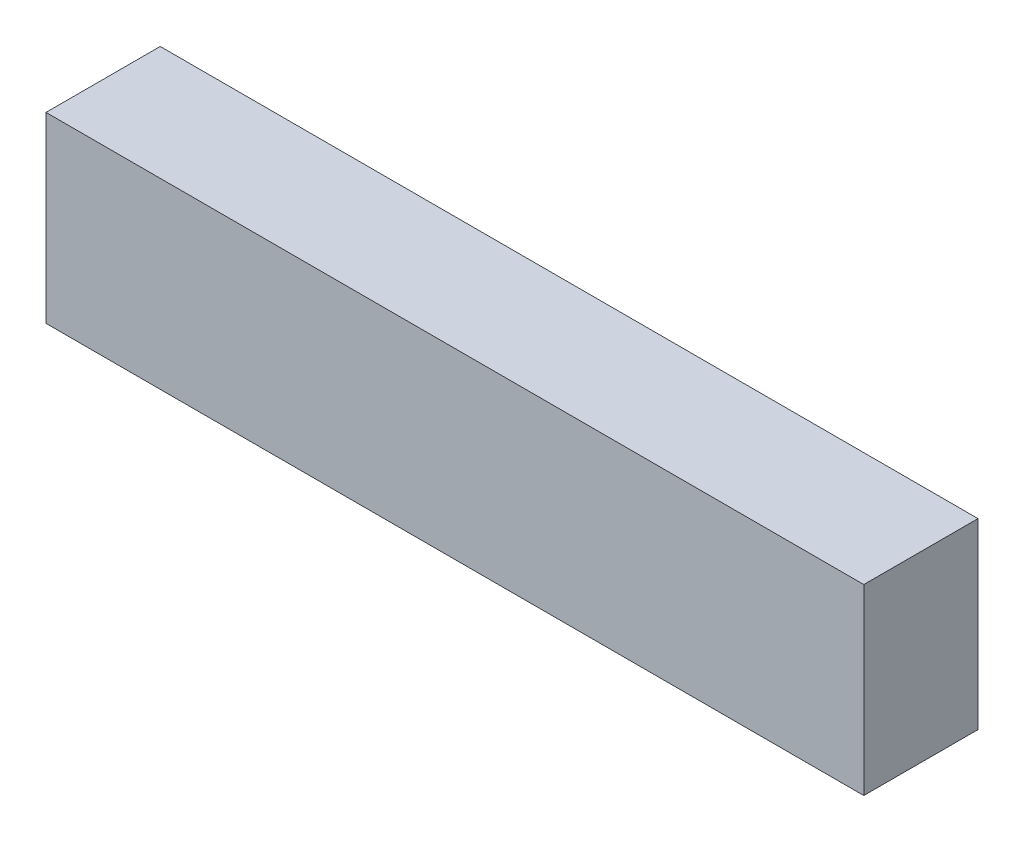
ISO-10303-21;
HEADER;
FILE_DESCRIPTION(('STEP AP214'),'2;1');
FILE_NAME('part.step','',(''),(''),'','','');
FILE_SCHEMA(('AUTOMOTIVE_DESIGN { 1 0 10303 214 1 1 1 1 }'));
ENDSEC;
DATA;
#1=APPLICATION_CONTEXT('core data for automotive mechanical design processes');
#2=APPLICATION_PROTOCOL_DEFINITION('international standard','automotive_design',2000,#1);
#3=PRODUCT_CONTEXT('',#1,'mechanical');
#4=PRODUCT('Part','Part','',(#3));
#5=PRODUCT_RELATED_PRODUCT_CATEGORY('part','',(#4));
#6=PRODUCT_DEFINITION_FORMATION('','',#4);
#7=PRODUCT_DEFINITION_CONTEXT('part definition',#1,'design');
#8=PRODUCT_DEFINITION('design','',#6,#7);
#9=PRODUCT_DEFINITION_SHAPE('','',#8);
#10=(LENGTH_UNIT() NAMED_UNIT(*) SI_UNIT(.MILLI.,.METRE.));
#11=(NAMED_UNIT(*) PLANE_ANGLE_UNIT() SI_UNIT($,.RADIAN.));
#12=(NAMED_UNIT(*) SI_UNIT($,.STERADIAN.) SOLID_ANGLE_UNIT());
#13=UNCERTAINTY_MEASURE_WITH_UNIT(LENGTH_MEASURE(1.E-05),#10,'distance_accuracy_value','');
#14=(GEOMETRIC_REPRESENTATION_CONTEXT(3) GLOBAL_UNCERTAINTY_ASSIGNED_CONTEXT((#13)) GLOBAL_UNIT_ASSIGNED_CONTEXT((#10,
#11,#12)) REPRESENTATION_CONTEXT('',''));
#15=CARTESIAN_POINT('',(0.,0.,0.));
#16=DIRECTION('',(0.,0.,1.));
#17=DIRECTION('',(1.,0.,0.));
#18=AXIS2_PLACEMENT_3D('',#15,#16,#17);
#19=CARTESIAN_POINT('',(0.,0.,25.));
#20=DIRECTION('',(1.,0.,0.));
#21=DIRECTION('',(0.,0.,-1.));
#22=AXIS2_PLACEMENT_3D('',#19,#20,#21);
#23=PLANE('',#22);
#24=DIRECTION('',(0.,-1.,0.));
#25=VECTOR('',#24,1.);
#26=CARTESIAN_POINT('',(0.,0.,0.));
#27=LINE('',#26,#25);
#28=CARTESIAN_POINT('',(0.,40.,0.));
#29=VERTEX_POINT('',#28);
#30=CARTESIAN_POINT('',(0.,0.,0.));
#31=VERTEX_POINT('',#30);
#32=EDGE_CURVE('E96',#29,#31,#27,.T.);
#33=ORIENTED_EDGE('',*,*,#32,.T.);
#34=DIRECTION('',(0.,0.,-1.));
#35=VECTOR('',#34,1.);
#36=CARTESIAN_POINT('',(0.,0.,25.));
#37=LINE('',#36,#35);
#38=CARTESIAN_POINT('',(0.,0.,25.));
#39=VERTEX_POINT('',#38);
#40=EDGE_CURVE('E11',#39,#31,#37,.T.);
#41=ORIENTED_EDGE('',*,*,#40,.F.);
#42=DIRECTION('',(0.,-1.,0.));
#43=VECTOR('',#42,1.);
#44=CARTESIAN_POINT('',(0.,0.,25.));
#45=LINE('',#44,#43);
#46=CARTESIAN_POINT('',(0.,40.,25.));
#47=VERTEX_POINT('',#46);
#48=EDGE_CURVE('E84',#47,#39,#45,.T.);
#49=ORIENTED_EDGE('',*,*,#48,.F.);
#50=DIRECTION('',(0.,0.,-1.));
#51=VECTOR('',#50,1.);
#52=CARTESIAN_POINT('',(0.,40.,25.));
#53=LINE('',#52,#51);
#54=EDGE_CURVE('E92',#47,#29,#53,.T.);
#55=ORIENTED_EDGE('',*,*,#54,.T.);
#56=EDGE_LOOP('',(#33,#41,#49,#55));
#57=FACE_BOUND('',#56,.T.);
#58=ADVANCED_FACE('F33',(#57),#23,.F.);
#59=CARTESIAN_POINT('',(0.,0.,25.));
#60=DIRECTION('',(0.,1.,0.));
#61=DIRECTION('',(0.,0.,1.));
#62=AXIS2_PLACEMENT_3D('',#59,#60,#61);
#63=PLANE('',#62);
#64=DIRECTION('',(1.,0.,0.));
#65=VECTOR('',#64,1.);
#66=CARTESIAN_POINT('',(0.,0.,0.));
#67=LINE('',#66,#65);
#68=CARTESIAN_POINT('',(179.,0.,0.));
#69=VERTEX_POINT('',#68);
#70=EDGE_CURVE('E88',#31,#69,#67,.T.);
#71=ORIENTED_EDGE('',*,*,#70,.T.);
#72=DIRECTION('',(0.,0.,-1.));
#73=VECTOR('',#72,1.);
#74=CARTESIAN_POINT('',(179.,0.,25.));
#75=LINE('',#74,#73);
#76=CARTESIAN_POINT('',(179.,0.,25.));
#77=VERTEX_POINT('',#76);
#78=EDGE_CURVE('E41',#77,#69,#75,.T.);
#79=ORIENTED_EDGE('',*,*,#78,.F.);
#80=DIRECTION('',(1.,0.,0.));
#81=VECTOR('',#80,1.);
#82=CARTESIAN_POINT('',(0.,0.,25.));
#83=LINE('',#82,#81);
#84=EDGE_CURVE('E79',#39,#77,#83,.T.);
#85=ORIENTED_EDGE('',*,*,#84,.F.);
#86=ORIENTED_EDGE('',*,*,#40,.T.);
#87=EDGE_LOOP('',(#71,#79,#85,#86));
#88=FACE_BOUND('',#87,.T.);
#89=ADVANCED_FACE('F87',(#88),#63,.F.);
#90=CARTESIAN_POINT('',(179.,0.,25.));
#91=DIRECTION('',(-1.,0.,0.));
#92=DIRECTION('',(0.,0.,1.));
#93=AXIS2_PLACEMENT_3D('',#90,#91,#92);
#94=PLANE('',#93);
#95=DIRECTION('',(0.,1.,0.));
#96=VECTOR('',#95,1.);
#97=CARTESIAN_POINT('',(179.,0.,0.));
#98=LINE('',#97,#96);
#99=CARTESIAN_POINT('',(179.,40.,0.));
#100=VERTEX_POINT('',#99);
#101=EDGE_CURVE('E66',#69,#100,#98,.T.);
#102=ORIENTED_EDGE('',*,*,#101,.T.);
#103=DIRECTION('',(0.,0.,-1.));
#104=VECTOR('',#103,1.);
#105=CARTESIAN_POINT('',(179.,40.,25.));
#106=LINE('',#105,#104);
#107=CARTESIAN_POINT('',(179.,40.,25.));
#108=VERTEX_POINT('',#107);
#109=EDGE_CURVE('E89',#108,#100,#106,.T.);
#110=ORIENTED_EDGE('',*,*,#109,.F.);
#111=DIRECTION('',(0.,1.,0.));
#112=VECTOR('',#111,1.);
#113=CARTESIAN_POINT('',(179.,0.,25.));
#114=LINE('',#113,#112);
#115=EDGE_CURVE('E82',#77,#108,#114,.T.);
#116=ORIENTED_EDGE('',*,*,#115,.F.);
#117=ORIENTED_EDGE('',*,*,#78,.T.);
#118=EDGE_LOOP('',(#102,#110,#116,#117));
#119=FACE_BOUND('',#118,.T.);
#120=ADVANCED_FACE('F90',(#119),#94,.F.);
#121=CARTESIAN_POINT('',(0.,40.,25.));
#122=DIRECTION('',(0.,-1.,0.));
#123=DIRECTION('',(0.,0.,-1.));
#124=AXIS2_PLACEMENT_3D('',#121,#122,#123);
#125=PLANE('',#124);
#126=DIRECTION('',(-1.,0.,0.));
#127=VECTOR('',#126,1.);
#128=CARTESIAN_POINT('',(0.,40.,0.));
#129=LINE('',#128,#127);
#130=EDGE_CURVE('E72',#100,#29,#129,.T.);
#131=ORIENTED_EDGE('',*,*,#130,.T.);
#132=ORIENTED_EDGE('',*,*,#54,.F.);
#133=DIRECTION('',(-1.,0.,0.));
#134=VECTOR('',#133,1.);
#135=CARTESIAN_POINT('',(0.,40.,25.));
#136=LINE('',#135,#134);
#137=EDGE_CURVE('E49',#108,#47,#136,.T.);
#138=ORIENTED_EDGE('',*,*,#137,.F.);
#139=ORIENTED_EDGE('',*,*,#109,.T.);
#140=EDGE_LOOP('',(#131,#132,#138,#139));
#141=FACE_BOUND('',#140,.T.);
#142=ADVANCED_FACE('F103',(#141),#125,.F.);
#143=CARTESIAN_POINT('',(0.,0.,25.));
#144=DIRECTION('',(0.,0.,-1.));
#145=DIRECTION('',(-1.,0.,0.));
#146=AXIS2_PLACEMENT_3D('',#143,#144,#145);
#147=PLANE('',#146);
#148=ORIENTED_EDGE('',*,*,#48,.T.);
#149=ORIENTED_EDGE('',*,*,#84,.T.);
#150=ORIENTED_EDGE('',*,*,#115,.T.);
#151=ORIENTED_EDGE('',*,*,#137,.T.);
#152=EDGE_LOOP('',(#148,#149,#150,#151));
#153=FACE_BOUND('',#152,.T.);
#154=ADVANCED_FACE('F80',(#153),#147,.F.);
#155=CARTESIAN_POINT('',(0.,0.,0.));
#156=DIRECTION('',(0.,0.,-1.));
#157=DIRECTION('',(-1.,0.,0.));
#158=AXIS2_PLACEMENT_3D('',#155,#156,#157);
#159=PLANE('',#158);
#160=ORIENTED_EDGE('',*,*,#32,.F.);
#161=ORIENTED_EDGE('',*,*,#130,.F.);
#162=ORIENTED_EDGE('',*,*,#101,.F.);
#163=ORIENTED_EDGE('',*,*,#70,.F.);
#164=EDGE_LOOP('',(#160,#161,#162,#163));
#165=FACE_BOUND('',#164,.T.);
#166=ADVANCED_FACE('F106',(#165),#159,.T.);
#167=CLOSED_SHELL('',(#58,#89,#120,#142,#154,#166));
#168=MANIFOLD_SOLID_BREP('B2',#167);
#169=ADVANCED_BREP_SHAPE_REPRESENTATION('',(#18,#168),#14);
#170=SHAPE_DEFINITION_REPRESENTATION(#9,#169);
ENDSEC;
END-ISO-10303-21;
